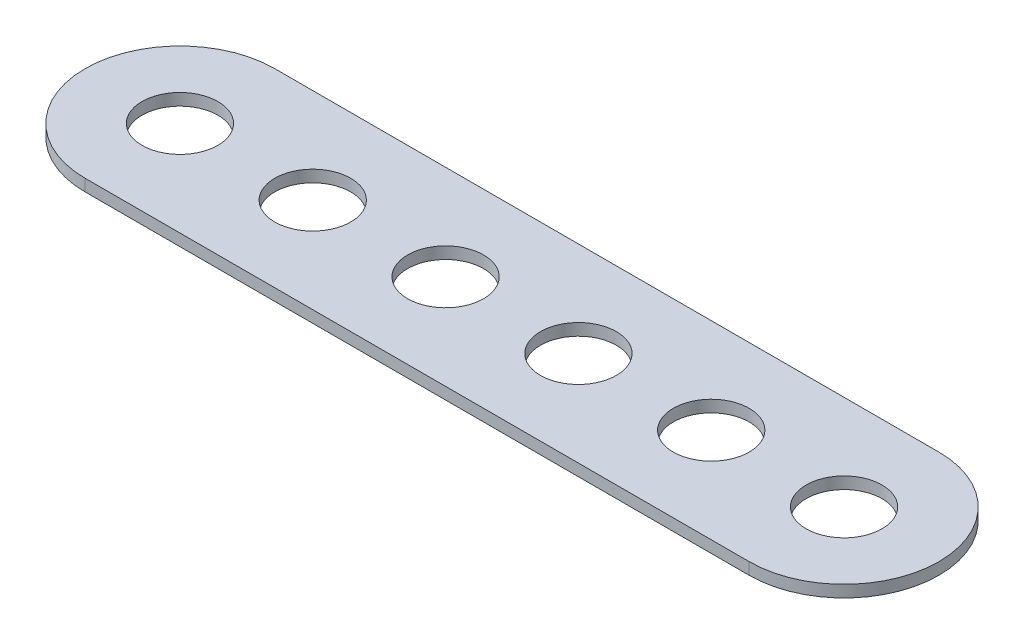
ISO-10303-21;
HEADER;
FILE_DESCRIPTION(('STEP AP214'),'2;1');
FILE_NAME('part.step','',(''),(''),'','','');
FILE_SCHEMA(('AUTOMOTIVE_DESIGN { 1 0 10303 214 1 1 1 1 }'));
ENDSEC;
DATA;
#1=APPLICATION_CONTEXT('core data for automotive mechanical design processes');
#2=APPLICATION_PROTOCOL_DEFINITION('international standard','automotive_design',2000,#1);
#3=PRODUCT_CONTEXT('',#1,'mechanical');
#4=PRODUCT('Part','Part','',(#3));
#5=PRODUCT_RELATED_PRODUCT_CATEGORY('part','',(#4));
#6=PRODUCT_DEFINITION_FORMATION('','',#4);
#7=PRODUCT_DEFINITION_CONTEXT('part definition',#1,'design');
#8=PRODUCT_DEFINITION('design','',#6,#7);
#9=PRODUCT_DEFINITION_SHAPE('','',#8);
#10=(LENGTH_UNIT() NAMED_UNIT(*) SI_UNIT(.MILLI.,.METRE.));
#11=(NAMED_UNIT(*) PLANE_ANGLE_UNIT() SI_UNIT($,.RADIAN.));
#12=(NAMED_UNIT(*) SI_UNIT($,.STERADIAN.) SOLID_ANGLE_UNIT());
#13=UNCERTAINTY_MEASURE_WITH_UNIT(LENGTH_MEASURE(1.E-05),#10,'distance_accuracy_value','');
#14=(GEOMETRIC_REPRESENTATION_CONTEXT(3) GLOBAL_UNCERTAINTY_ASSIGNED_CONTEXT((#13)) GLOBAL_UNIT_ASSIGNED_CONTEXT((#10,
#11,#12)) REPRESENTATION_CONTEXT('',''));
#15=CARTESIAN_POINT('',(0.,0.,0.));
#16=DIRECTION('',(0.,0.,1.));
#17=DIRECTION('',(1.,0.,0.));
#18=AXIS2_PLACEMENT_3D('',#15,#16,#17);
#19=CARTESIAN_POINT('',(0.,0.,0.));
#20=DIRECTION('',(0.,1.,0.));
#21=DIRECTION('',(0.,0.,1.));
#22=AXIS2_PLACEMENT_3D('',#19,#20,#21);
#23=CYLINDRICAL_SURFACE('',#22,10.16);
#24=CARTESIAN_POINT('',(0.,0.,0.));
#25=DIRECTION('',(0.,1.,0.));
#26=DIRECTION('',(0.,0.,1.));
#27=AXIS2_PLACEMENT_3D('',#24,#25,#26);
#28=CIRCLE('',#27,10.16);
#29=CARTESIAN_POINT('',(0.,0.,10.16));
#30=VERTEX_POINT('',#29);
#31=EDGE_CURVE('E48',#30,#30,#28,.T.);
#32=ORIENTED_EDGE('',*,*,#31,.F.);
#33=EDGE_LOOP('',(#32));
#34=FACE_BOUND('',#33,.T.);
#35=CARTESIAN_POINT('',(0.,3.175,0.));
#36=DIRECTION('',(0.,1.,0.));
#37=DIRECTION('',(0.,0.,1.));
#38=AXIS2_PLACEMENT_3D('',#35,#36,#37);
#39=CIRCLE('',#38,10.16);
#40=CARTESIAN_POINT('',(0.,3.175,10.16));
#41=VERTEX_POINT('',#40);
#42=EDGE_CURVE('E11',#41,#41,#39,.T.);
#43=ORIENTED_EDGE('',*,*,#42,.T.);
#44=EDGE_LOOP('',(#43));
#45=FACE_BOUND('',#44,.T.);
#46=ADVANCED_FACE('F39',(#34,#45),#23,.F.);
#47=CARTESIAN_POINT('',(-35.56,0.,0.));
#48=DIRECTION('',(0.,1.,0.));
#49=DIRECTION('',(0.,0.,1.));
#50=AXIS2_PLACEMENT_3D('',#47,#48,#49);
#51=CYLINDRICAL_SURFACE('',#50,10.16);
#52=CARTESIAN_POINT('',(-35.56,0.,0.));
#53=DIRECTION('',(0.,1.,0.));
#54=DIRECTION('',(0.,0.,1.));
#55=AXIS2_PLACEMENT_3D('',#52,#53,#54);
#56=CIRCLE('',#55,10.16);
#57=CARTESIAN_POINT('',(-35.56,0.,10.16));
#58=VERTEX_POINT('',#57);
#59=EDGE_CURVE('E152',#58,#58,#56,.T.);
#60=ORIENTED_EDGE('',*,*,#59,.F.);
#61=EDGE_LOOP('',(#60));
#62=FACE_BOUND('',#61,.T.);
#63=CARTESIAN_POINT('',(-35.56,3.175,0.));
#64=DIRECTION('',(0.,1.,0.));
#65=DIRECTION('',(0.,0.,1.));
#66=AXIS2_PLACEMENT_3D('',#63,#64,#65);
#67=CIRCLE('',#66,10.16);
#68=CARTESIAN_POINT('',(-35.56,3.175,10.16));
#69=VERTEX_POINT('',#68);
#70=EDGE_CURVE('E156',#69,#69,#67,.T.);
#71=ORIENTED_EDGE('',*,*,#70,.T.);
#72=EDGE_LOOP('',(#71));
#73=FACE_BOUND('',#72,.T.);
#74=ADVANCED_FACE('F168',(#62,#73),#51,.F.);
#75=CARTESIAN_POINT('',(-71.12,0.,0.));
#76=DIRECTION('',(0.,1.,0.));
#77=DIRECTION('',(0.,0.,1.));
#78=AXIS2_PLACEMENT_3D('',#75,#76,#77);
#79=CYLINDRICAL_SURFACE('',#78,10.16);
#80=CARTESIAN_POINT('',(-71.12,0.,0.));
#81=DIRECTION('',(0.,1.,0.));
#82=DIRECTION('',(0.,0.,1.));
#83=AXIS2_PLACEMENT_3D('',#80,#81,#82);
#84=CIRCLE('',#83,10.16);
#85=CARTESIAN_POINT('',(-71.12,0.,10.16));
#86=VERTEX_POINT('',#85);
#87=EDGE_CURVE('E144',#86,#86,#84,.T.);
#88=ORIENTED_EDGE('',*,*,#87,.F.);
#89=EDGE_LOOP('',(#88));
#90=FACE_BOUND('',#89,.T.);
#91=CARTESIAN_POINT('',(-71.12,3.175,0.));
#92=DIRECTION('',(0.,1.,0.));
#93=DIRECTION('',(0.,0.,1.));
#94=AXIS2_PLACEMENT_3D('',#91,#92,#93);
#95=CIRCLE('',#94,10.16);
#96=CARTESIAN_POINT('',(-71.12,3.175,10.16));
#97=VERTEX_POINT('',#96);
#98=EDGE_CURVE('E148',#97,#97,#95,.T.);
#99=ORIENTED_EDGE('',*,*,#98,.T.);
#100=EDGE_LOOP('',(#99));
#101=FACE_BOUND('',#100,.T.);
#102=ADVANCED_FACE('F222',(#90,#101),#79,.F.);
#103=CARTESIAN_POINT('',(-106.68,0.,0.));
#104=DIRECTION('',(0.,1.,0.));
#105=DIRECTION('',(0.,0.,1.));
#106=AXIS2_PLACEMENT_3D('',#103,#104,#105);
#107=CYLINDRICAL_SURFACE('',#106,10.16);
#108=CARTESIAN_POINT('',(-106.68,0.,0.));
#109=DIRECTION('',(0.,1.,0.));
#110=DIRECTION('',(0.,0.,1.));
#111=AXIS2_PLACEMENT_3D('',#108,#109,#110);
#112=CIRCLE('',#111,10.16);
#113=CARTESIAN_POINT('',(-106.68,0.,10.16));
#114=VERTEX_POINT('',#113);
#115=EDGE_CURVE('E136',#114,#114,#112,.T.);
#116=ORIENTED_EDGE('',*,*,#115,.F.);
#117=EDGE_LOOP('',(#116));
#118=FACE_BOUND('',#117,.T.);
#119=CARTESIAN_POINT('',(-106.68,3.175,0.));
#120=DIRECTION('',(0.,1.,0.));
#121=DIRECTION('',(0.,0.,1.));
#122=AXIS2_PLACEMENT_3D('',#119,#120,#121);
#123=CIRCLE('',#122,10.16);
#124=CARTESIAN_POINT('',(-106.68,3.175,10.16));
#125=VERTEX_POINT('',#124);
#126=EDGE_CURVE('E140',#125,#125,#123,.T.);
#127=ORIENTED_EDGE('',*,*,#126,.T.);
#128=EDGE_LOOP('',(#127));
#129=FACE_BOUND('',#128,.T.);
#130=ADVANCED_FACE('F218',(#118,#129),#107,.F.);
#131=CARTESIAN_POINT('',(-142.24,0.,0.));
#132=DIRECTION('',(0.,1.,0.));
#133=DIRECTION('',(0.,0.,1.));
#134=AXIS2_PLACEMENT_3D('',#131,#132,#133);
#135=CYLINDRICAL_SURFACE('',#134,10.16);
#136=CARTESIAN_POINT('',(-142.24,0.,0.));
#137=DIRECTION('',(0.,1.,0.));
#138=DIRECTION('',(0.,0.,1.));
#139=AXIS2_PLACEMENT_3D('',#136,#137,#138);
#140=CIRCLE('',#139,10.16);
#141=CARTESIAN_POINT('',(-142.24,0.,10.16));
#142=VERTEX_POINT('',#141);
#143=EDGE_CURVE('E128',#142,#142,#140,.T.);
#144=ORIENTED_EDGE('',*,*,#143,.F.);
#145=EDGE_LOOP('',(#144));
#146=FACE_BOUND('',#145,.T.);
#147=CARTESIAN_POINT('',(-142.24,3.175,0.));
#148=DIRECTION('',(0.,1.,0.));
#149=DIRECTION('',(0.,0.,1.));
#150=AXIS2_PLACEMENT_3D('',#147,#148,#149);
#151=CIRCLE('',#150,10.16);
#152=CARTESIAN_POINT('',(-142.24,3.175,10.16));
#153=VERTEX_POINT('',#152);
#154=EDGE_CURVE('E132',#153,#153,#151,.T.);
#155=ORIENTED_EDGE('',*,*,#154,.T.);
#156=EDGE_LOOP('',(#155));
#157=FACE_BOUND('',#156,.T.);
#158=ADVANCED_FACE('F214',(#146,#157),#135,.F.);
#159=CARTESIAN_POINT('',(0.,3.175,0.));
#160=DIRECTION('',(0.,-1.,0.));
#161=DIRECTION('',(0.,0.,-1.));
#162=AXIS2_PLACEMENT_3D('',#159,#160,#161);
#163=CYLINDRICAL_SURFACE('',#162,25.4);
#164=CARTESIAN_POINT('',(0.,0.,0.));
#165=DIRECTION('',(0.,1.,0.));
#166=DIRECTION('',(0.,0.,1.));
#167=AXIS2_PLACEMENT_3D('',#164,#165,#166);
#168=CIRCLE('',#167,25.4);
#169=CARTESIAN_POINT('',(0.,0.,25.4));
#170=VERTEX_POINT('',#169);
#171=CARTESIAN_POINT('',(0.,0.,-25.4));
#172=VERTEX_POINT('',#171);
#173=EDGE_CURVE('E111',#170,#172,#168,.T.);
#174=ORIENTED_EDGE('',*,*,#173,.T.);
#175=DIRECTION('',(0.,-1.,0.));
#176=VECTOR('',#175,1.);
#177=CARTESIAN_POINT('',(0.,3.175,-25.4));
#178=LINE('',#177,#176);
#179=CARTESIAN_POINT('',(0.,3.175,-25.4));
#180=VERTEX_POINT('',#179);
#181=EDGE_CURVE('E100',#180,#172,#178,.T.);
#182=ORIENTED_EDGE('',*,*,#181,.F.);
#183=CARTESIAN_POINT('',(0.,3.175,0.));
#184=DIRECTION('',(0.,1.,0.));
#185=DIRECTION('',(0.,0.,1.));
#186=AXIS2_PLACEMENT_3D('',#183,#184,#185);
#187=CIRCLE('',#186,25.4);
#188=CARTESIAN_POINT('',(0.,3.175,25.4));
#189=VERTEX_POINT('',#188);
#190=EDGE_CURVE('E92',#189,#180,#187,.T.);
#191=ORIENTED_EDGE('',*,*,#190,.F.);
#192=DIRECTION('',(0.,-1.,0.));
#193=VECTOR('',#192,1.);
#194=CARTESIAN_POINT('',(0.,3.175,25.4));
#195=LINE('',#194,#193);
#196=EDGE_CURVE('E107',#189,#170,#195,.T.);
#197=ORIENTED_EDGE('',*,*,#196,.T.);
#198=EDGE_LOOP('',(#174,#182,#191,#197));
#199=FACE_BOUND('',#198,.T.);
#200=ADVANCED_FACE('F211',(#199),#163,.T.);
#201=CARTESIAN_POINT('',(0.,3.175,-25.4));
#202=DIRECTION('',(0.,0.,1.));
#203=DIRECTION('',(1.,0.,0.));
#204=AXIS2_PLACEMENT_3D('',#201,#202,#203);
#205=PLANE('',#204);
#206=DIRECTION('',(-1.,0.,0.));
#207=VECTOR('',#206,1.);
#208=CARTESIAN_POINT('',(0.,0.,-25.4));
#209=LINE('',#208,#207);
#210=CARTESIAN_POINT('',(-177.8,0.,-25.4));
#211=VERTEX_POINT('',#210);
#212=EDGE_CURVE('E98',#172,#211,#209,.T.);
#213=ORIENTED_EDGE('',*,*,#212,.T.);
#214=DIRECTION('',(0.,-1.,0.));
#215=VECTOR('',#214,1.);
#216=CARTESIAN_POINT('',(-177.8,3.175,-25.4));
#217=LINE('',#216,#215);
#218=CARTESIAN_POINT('',(-177.8,3.175,-25.4));
#219=VERTEX_POINT('',#218);
#220=EDGE_CURVE('E96',#219,#211,#217,.T.);
#221=ORIENTED_EDGE('',*,*,#220,.F.);
#222=DIRECTION('',(-1.,0.,0.));
#223=VECTOR('',#222,1.);
#224=CARTESIAN_POINT('',(0.,3.175,-25.4));
#225=LINE('',#224,#223);
#226=EDGE_CURVE('E87',#180,#219,#225,.T.);
#227=ORIENTED_EDGE('',*,*,#226,.F.);
#228=ORIENTED_EDGE('',*,*,#181,.T.);
#229=EDGE_LOOP('',(#213,#221,#227,#228));
#230=FACE_BOUND('',#229,.T.);
#231=ADVANCED_FACE('F97',(#230),#205,.F.);
#232=CARTESIAN_POINT('',(-177.8,3.175,0.));
#233=DIRECTION('',(0.,-1.,0.));
#234=DIRECTION('',(0.,0.,-1.));
#235=AXIS2_PLACEMENT_3D('',#232,#233,#234);
#236=CYLINDRICAL_SURFACE('',#235,25.4);
#237=CARTESIAN_POINT('',(-177.8,0.,0.));
#238=DIRECTION('',(0.,1.,0.));
#239=DIRECTION('',(0.,0.,1.));
#240=AXIS2_PLACEMENT_3D('',#237,#238,#239);
#241=CIRCLE('',#240,25.4);
#242=CARTESIAN_POINT('',(-177.8,0.,25.4));
#243=VERTEX_POINT('',#242);
#244=EDGE_CURVE('E73',#211,#243,#241,.T.);
#245=ORIENTED_EDGE('',*,*,#244,.T.);
#246=DIRECTION('',(0.,-1.,0.));
#247=VECTOR('',#246,1.);
#248=CARTESIAN_POINT('',(-177.8,3.175,25.4));
#249=LINE('',#248,#247);
#250=CARTESIAN_POINT('',(-177.8,3.175,25.4));
#251=VERTEX_POINT('',#250);
#252=EDGE_CURVE('E101',#251,#243,#249,.T.);
#253=ORIENTED_EDGE('',*,*,#252,.F.);
#254=CARTESIAN_POINT('',(-177.8,3.175,0.));
#255=DIRECTION('',(0.,1.,0.));
#256=DIRECTION('',(0.,0.,1.));
#257=AXIS2_PLACEMENT_3D('',#254,#255,#256);
#258=CIRCLE('',#257,25.4);
#259=EDGE_CURVE('E90',#219,#251,#258,.T.);
#260=ORIENTED_EDGE('',*,*,#259,.F.);
#261=ORIENTED_EDGE('',*,*,#220,.T.);
#262=EDGE_LOOP('',(#245,#253,#260,#261));
#263=FACE_BOUND('',#262,.T.);
#264=ADVANCED_FACE('F103',(#263),#236,.T.);
#265=CARTESIAN_POINT('',(0.,3.175,25.4));
#266=DIRECTION('',(0.,0.,-1.));
#267=DIRECTION('',(-1.,0.,0.));
#268=AXIS2_PLACEMENT_3D('',#265,#266,#267);
#269=PLANE('',#268);
#270=DIRECTION('',(1.,0.,0.));
#271=VECTOR('',#270,1.);
#272=CARTESIAN_POINT('',(0.,0.,25.4));
#273=LINE('',#272,#271);
#274=EDGE_CURVE('E79',#243,#170,#273,.T.);
#275=ORIENTED_EDGE('',*,*,#274,.T.);
#276=ORIENTED_EDGE('',*,*,#196,.F.);
#277=DIRECTION('',(1.,0.,0.));
#278=VECTOR('',#277,1.);
#279=CARTESIAN_POINT('',(0.,3.175,25.4));
#280=LINE('',#279,#278);
#281=EDGE_CURVE('E56',#251,#189,#280,.T.);
#282=ORIENTED_EDGE('',*,*,#281,.F.);
#283=ORIENTED_EDGE('',*,*,#252,.T.);
#284=EDGE_LOOP('',(#275,#276,#282,#283));
#285=FACE_BOUND('',#284,.T.);
#286=ADVANCED_FACE('F173',(#285),#269,.F.);
#287=CARTESIAN_POINT('',(0.,3.175,0.));
#288=DIRECTION('',(0.,1.,0.));
#289=DIRECTION('',(0.,0.,1.));
#290=AXIS2_PLACEMENT_3D('',#287,#288,#289);
#291=PLANE('',#290);
#292=ORIENTED_EDGE('',*,*,#42,.F.);
#293=EDGE_LOOP('',(#292));
#294=FACE_BOUND('',#293,.T.);
#295=ORIENTED_EDGE('',*,*,#70,.F.);
#296=EDGE_LOOP('',(#295));
#297=FACE_BOUND('',#296,.T.);
#298=ORIENTED_EDGE('',*,*,#98,.F.);
#299=EDGE_LOOP('',(#298));
#300=FACE_BOUND('',#299,.T.);
#301=ORIENTED_EDGE('',*,*,#126,.F.);
#302=EDGE_LOOP('',(#301));
#303=FACE_BOUND('',#302,.T.);
#304=ORIENTED_EDGE('',*,*,#154,.F.);
#305=EDGE_LOOP('',(#304));
#306=FACE_BOUND('',#305,.T.);
#307=CARTESIAN_POINT('',(-177.8,3.175,0.));
#308=DIRECTION('',(0.,1.,0.));
#309=DIRECTION('',(0.,0.,1.));
#310=AXIS2_PLACEMENT_3D('',#307,#308,#309);
#311=CIRCLE('',#310,10.16);
#312=CARTESIAN_POINT('',(-177.8,3.175,10.16));
#313=VERTEX_POINT('',#312);
#314=EDGE_CURVE('E185',#313,#313,#311,.T.);
#315=ORIENTED_EDGE('',*,*,#314,.F.);
#316=EDGE_LOOP('',(#315));
#317=FACE_BOUND('',#316,.T.);
#318=ORIENTED_EDGE('',*,*,#190,.T.);
#319=ORIENTED_EDGE('',*,*,#226,.T.);
#320=ORIENTED_EDGE('',*,*,#259,.T.);
#321=ORIENTED_EDGE('',*,*,#281,.T.);
#322=EDGE_LOOP('',(#318,#319,#320,#321));
#323=FACE_BOUND('',#322,.T.);
#324=ADVANCED_FACE('F88',(#294,#297,#300,#303,#306,#317,#323),#291,.T.);
#325=CARTESIAN_POINT('',(0.,0.,0.));
#326=DIRECTION('',(0.,1.,0.));
#327=DIRECTION('',(0.,0.,1.));
#328=AXIS2_PLACEMENT_3D('',#325,#326,#327);
#329=PLANE('',#328);
#330=ORIENTED_EDGE('',*,*,#31,.T.);
#331=EDGE_LOOP('',(#330));
#332=FACE_BOUND('',#331,.T.);
#333=ORIENTED_EDGE('',*,*,#59,.T.);
#334=EDGE_LOOP('',(#333));
#335=FACE_BOUND('',#334,.T.);
#336=ORIENTED_EDGE('',*,*,#87,.T.);
#337=EDGE_LOOP('',(#336));
#338=FACE_BOUND('',#337,.T.);
#339=ORIENTED_EDGE('',*,*,#115,.T.);
#340=EDGE_LOOP('',(#339));
#341=FACE_BOUND('',#340,.T.);
#342=ORIENTED_EDGE('',*,*,#143,.T.);
#343=EDGE_LOOP('',(#342));
#344=FACE_BOUND('',#343,.T.);
#345=CARTESIAN_POINT('',(-177.8,0.,0.));
#346=DIRECTION('',(0.,1.,0.));
#347=DIRECTION('',(0.,0.,1.));
#348=AXIS2_PLACEMENT_3D('',#345,#346,#347);
#349=CIRCLE('',#348,10.16);
#350=CARTESIAN_POINT('',(-177.8,0.,10.16));
#351=VERTEX_POINT('',#350);
#352=EDGE_CURVE('E115',#351,#351,#349,.T.);
#353=ORIENTED_EDGE('',*,*,#352,.T.);
#354=EDGE_LOOP('',(#353));
#355=FACE_BOUND('',#354,.T.);
#356=ORIENTED_EDGE('',*,*,#173,.F.);
#357=ORIENTED_EDGE('',*,*,#274,.F.);
#358=ORIENTED_EDGE('',*,*,#244,.F.);
#359=ORIENTED_EDGE('',*,*,#212,.F.);
#360=EDGE_LOOP('',(#356,#357,#358,#359));
#361=FACE_BOUND('',#360,.T.);
#362=ADVANCED_FACE('F163',(#332,#335,#338,#341,#344,#355,#361),#329,.F.);
#363=CARTESIAN_POINT('',(-177.8,0.,0.));
#364=DIRECTION('',(0.,1.,0.));
#365=DIRECTION('',(0.,0.,1.));
#366=AXIS2_PLACEMENT_3D('',#363,#364,#365);
#367=CYLINDRICAL_SURFACE('',#366,10.16);
#368=ORIENTED_EDGE('',*,*,#352,.F.);
#369=EDGE_LOOP('',(#368));
#370=FACE_BOUND('',#369,.T.);
#371=ORIENTED_EDGE('',*,*,#314,.T.);
#372=EDGE_LOOP('',(#371));
#373=FACE_BOUND('',#372,.T.);
#374=ADVANCED_FACE('F197',(#370,#373),#367,.F.);
#375=CLOSED_SHELL('',(#46,#74,#102,#130,#158,#200,#231,#264,#286,#324,#362,#374));
#376=MANIFOLD_SOLID_BREP('B2',#375);
#377=ADVANCED_BREP_SHAPE_REPRESENTATION('',(#18,#376),#14);
#378=SHAPE_DEFINITION_REPRESENTATION(#9,#377);
ENDSEC;
END-ISO-10303-21;
